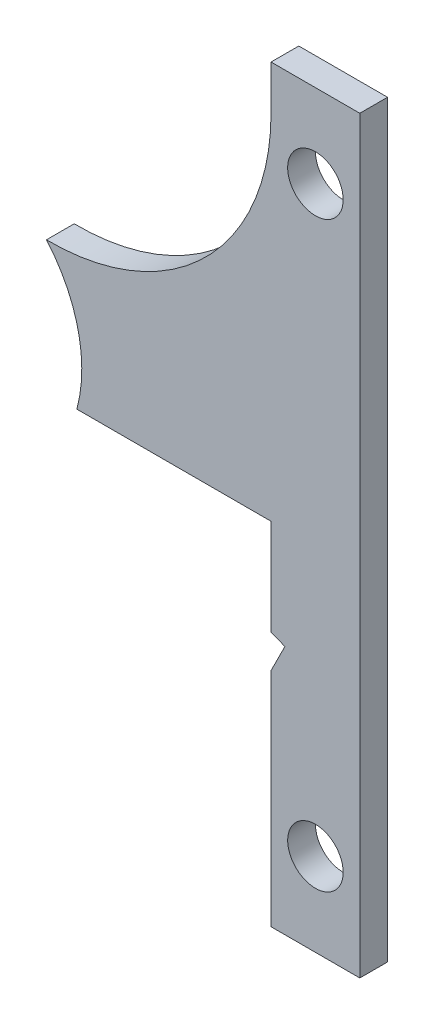
ISO-10303-21;
HEADER;
FILE_DESCRIPTION(('STEP AP214'),'2;1');
FILE_NAME('part.step','',(''),(''),'','','');
FILE_SCHEMA(('AUTOMOTIVE_DESIGN { 1 0 10303 214 1 1 1 1 }'));
ENDSEC;
DATA;
#1=APPLICATION_CONTEXT('core data for automotive mechanical design processes');
#2=APPLICATION_PROTOCOL_DEFINITION('international standard','automotive_design',2000,#1);
#3=PRODUCT_CONTEXT('',#1,'mechanical');
#4=PRODUCT('Part','Part','',(#3));
#5=PRODUCT_RELATED_PRODUCT_CATEGORY('part','',(#4));
#6=PRODUCT_DEFINITION_FORMATION('','',#4);
#7=PRODUCT_DEFINITION_CONTEXT('part definition',#1,'design');
#8=PRODUCT_DEFINITION('design','',#6,#7);
#9=PRODUCT_DEFINITION_SHAPE('','',#8);
#10=(LENGTH_UNIT() NAMED_UNIT(*) SI_UNIT(.MILLI.,.METRE.));
#11=(NAMED_UNIT(*) PLANE_ANGLE_UNIT() SI_UNIT($,.RADIAN.));
#12=(NAMED_UNIT(*) SI_UNIT($,.STERADIAN.) SOLID_ANGLE_UNIT());
#13=UNCERTAINTY_MEASURE_WITH_UNIT(LENGTH_MEASURE(1.E-05),#10,'distance_accuracy_value','');
#14=(GEOMETRIC_REPRESENTATION_CONTEXT(3) GLOBAL_UNCERTAINTY_ASSIGNED_CONTEXT((#13)) GLOBAL_UNIT_ASSIGNED_CONTEXT((#10,
#11,#12)) REPRESENTATION_CONTEXT('',''));
#15=CARTESIAN_POINT('',(0.,0.,0.));
#16=DIRECTION('',(0.,0.,1.));
#17=DIRECTION('',(1.,0.,0.));
#18=AXIS2_PLACEMENT_3D('',#15,#16,#17);
#19=CARTESIAN_POINT('',(60.,-24.0119449794001,2.5));
#20=DIRECTION('',(1.,0.,0.));
#21=DIRECTION('',(0.,0.,-1.));
#22=AXIS2_PLACEMENT_3D('',#19,#20,#21);
#23=PLANE('',#22);
#24=DIRECTION('',(0.,-1.,0.));
#25=VECTOR('',#24,1.);
#26=CARTESIAN_POINT('',(60.,-24.0119449794001,-2.5));
#27=LINE('',#26,#25);
#28=CARTESIAN_POINT('',(60.,-6.69872981077817,-2.5));
#29=VERTEX_POINT('',#28);
#30=CARTESIAN_POINT('',(60.,-24.0119449794001,-2.5));
#31=VERTEX_POINT('',#30);
#32=EDGE_CURVE('E147',#29,#31,#27,.T.);
#33=ORIENTED_EDGE('',*,*,#32,.T.);
#34=DIRECTION('',(0.,0.,-1.));
#35=VECTOR('',#34,1.);
#36=CARTESIAN_POINT('',(60.,-24.0119449794001,2.5));
#37=LINE('',#36,#35);
#38=CARTESIAN_POINT('',(60.,-24.0119449794001,2.5));
#39=VERTEX_POINT('',#38);
#40=EDGE_CURVE('E11',#39,#31,#37,.T.);
#41=ORIENTED_EDGE('',*,*,#40,.F.);
#42=DIRECTION('',(0.,-1.,0.));
#43=VECTOR('',#42,1.);
#44=CARTESIAN_POINT('',(60.,-24.0119449794001,2.5));
#45=LINE('',#44,#43);
#46=CARTESIAN_POINT('',(60.,-6.69872981077817,2.5));
#47=VERTEX_POINT('',#46);
#48=EDGE_CURVE('E170',#47,#39,#45,.T.);
#49=ORIENTED_EDGE('',*,*,#48,.F.);
#50=DIRECTION('',(0.,0.,-1.));
#51=VECTOR('',#50,1.);
#52=CARTESIAN_POINT('',(60.,-6.69872981077817,2.5));
#53=LINE('',#52,#51);
#54=EDGE_CURVE('E143',#47,#29,#53,.T.);
#55=ORIENTED_EDGE('',*,*,#54,.T.);
#56=EDGE_LOOP('',(#33,#41,#49,#55));
#57=FACE_BOUND('',#56,.T.);
#58=ADVANCED_FACE('F33',(#57),#23,.F.);
#59=CARTESIAN_POINT('',(62.49999830884,-25.,2.5));
#60=DIRECTION('',(0.367557094941416,0.930000958041564,0.));
#61=DIRECTION('',(-0.930000958041564,0.367557094941416,0.));
#62=AXIS2_PLACEMENT_3D('',#59,#60,#61);
#63=PLANE('',#62);
#64=DIRECTION('',(0.930000958041564,-0.367557094941416,0.));
#65=VECTOR('',#64,1.);
#66=CARTESIAN_POINT('',(62.49999830884,-25.,-2.5));
#67=LINE('',#66,#65);
#68=CARTESIAN_POINT('',(62.49999830884,-25.,-2.5));
#69=VERTEX_POINT('',#68);
#70=EDGE_CURVE('E150',#31,#69,#67,.T.);
#71=ORIENTED_EDGE('',*,*,#70,.T.);
#72=DIRECTION('',(0.,0.,-1.));
#73=VECTOR('',#72,1.);
#74=CARTESIAN_POINT('',(62.49999830884,-25.,2.5));
#75=LINE('',#74,#73);
#76=CARTESIAN_POINT('',(62.49999830884,-25.,2.5));
#77=VERTEX_POINT('',#76);
#78=EDGE_CURVE('E41',#77,#69,#75,.T.);
#79=ORIENTED_EDGE('',*,*,#78,.F.);
#80=DIRECTION('',(0.930000958041564,-0.367557094941416,0.));
#81=VECTOR('',#80,1.);
#82=CARTESIAN_POINT('',(62.49999830884,-25.,2.5));
#83=LINE('',#82,#81);
#84=EDGE_CURVE('E101',#39,#77,#83,.T.);
#85=ORIENTED_EDGE('',*,*,#84,.F.);
#86=ORIENTED_EDGE('',*,*,#40,.T.);
#87=EDGE_LOOP('',(#71,#79,#85,#86));
#88=FACE_BOUND('',#87,.T.);
#89=ADVANCED_FACE('F241',(#88),#63,.F.);
#90=CARTESIAN_POINT('',(60.,-30.,2.5));
#91=DIRECTION('',(0.894427312009458,-0.447213353480792,0.));
#92=DIRECTION('',(0.447213353480792,0.894427312009458,0.));
#93=AXIS2_PLACEMENT_3D('',#90,#91,#92);
#94=PLANE('',#93);
#95=DIRECTION('',(-0.447213353480792,-0.894427312009458,0.));
#96=VECTOR('',#95,1.);
#97=CARTESIAN_POINT('',(60.,-30.,-2.5));
#98=LINE('',#97,#96);
#99=CARTESIAN_POINT('',(60.,-30.,-2.5));
#100=VERTEX_POINT('',#99);
#101=EDGE_CURVE('E153',#69,#100,#98,.T.);
#102=ORIENTED_EDGE('',*,*,#101,.T.);
#103=DIRECTION('',(0.,0.,-1.));
#104=VECTOR('',#103,1.);
#105=CARTESIAN_POINT('',(60.,-30.,2.5));
#106=LINE('',#105,#104);
#107=CARTESIAN_POINT('',(60.,-30.,2.5));
#108=VERTEX_POINT('',#107);
#109=EDGE_CURVE('E186',#108,#100,#106,.T.);
#110=ORIENTED_EDGE('',*,*,#109,.F.);
#111=DIRECTION('',(-0.447213353480792,-0.894427312009458,0.));
#112=VECTOR('',#111,1.);
#113=CARTESIAN_POINT('',(60.,-30.,2.5));
#114=LINE('',#113,#112);
#115=EDGE_CURVE('E194',#77,#108,#114,.T.);
#116=ORIENTED_EDGE('',*,*,#115,.F.);
#117=ORIENTED_EDGE('',*,*,#78,.T.);
#118=EDGE_LOOP('',(#102,#110,#116,#117));
#119=FACE_BOUND('',#118,.T.);
#120=ADVANCED_FACE('F192',(#119),#94,.F.);
#121=CARTESIAN_POINT('',(60.,-70.,2.5));
#122=DIRECTION('',(1.,0.,0.));
#123=DIRECTION('',(0.,0.,-1.));
#124=AXIS2_PLACEMENT_3D('',#121,#122,#123);
#125=PLANE('',#124);
#126=DIRECTION('',(0.,-1.,0.));
#127=VECTOR('',#126,1.);
#128=CARTESIAN_POINT('',(60.,-70.,-2.5));
#129=LINE('',#128,#127);
#130=CARTESIAN_POINT('',(60.,-70.,-2.5));
#131=VERTEX_POINT('',#130);
#132=EDGE_CURVE('E155',#100,#131,#129,.T.);
#133=ORIENTED_EDGE('',*,*,#132,.T.);
#134=DIRECTION('',(0.,0.,-1.));
#135=VECTOR('',#134,1.);
#136=CARTESIAN_POINT('',(60.,-70.,2.5));
#137=LINE('',#136,#135);
#138=CARTESIAN_POINT('',(60.,-70.,2.5));
#139=VERTEX_POINT('',#138);
#140=EDGE_CURVE('E183',#139,#131,#137,.T.);
#141=ORIENTED_EDGE('',*,*,#140,.F.);
#142=DIRECTION('',(0.,-1.,0.));
#143=VECTOR('',#142,1.);
#144=CARTESIAN_POINT('',(60.,-70.,2.5));
#145=LINE('',#144,#143);
#146=EDGE_CURVE('E211',#108,#139,#145,.T.);
#147=ORIENTED_EDGE('',*,*,#146,.F.);
#148=ORIENTED_EDGE('',*,*,#109,.T.);
#149=EDGE_LOOP('',(#133,#141,#147,#148));
#150=FACE_BOUND('',#149,.T.);
#151=ADVANCED_FACE('F202',(#150),#125,.F.);
#152=CARTESIAN_POINT('',(75.999998510006,-70.,2.5));
#153=DIRECTION('',(0.,1.,0.));
#154=DIRECTION('',(0.,0.,1.));
#155=AXIS2_PLACEMENT_3D('',#152,#153,#154);
#156=PLANE('',#155);
#157=DIRECTION('',(1.,0.,0.));
#158=VECTOR('',#157,1.);
#159=CARTESIAN_POINT('',(75.999998510006,-70.,-2.5));
#160=LINE('',#159,#158);
#161=CARTESIAN_POINT('',(75.999998510006,-70.,-2.5));
#162=VERTEX_POINT('',#161);
#163=EDGE_CURVE('E157',#131,#162,#160,.T.);
#164=ORIENTED_EDGE('',*,*,#163,.T.);
#165=DIRECTION('',(0.,0.,-1.));
#166=VECTOR('',#165,1.);
#167=CARTESIAN_POINT('',(75.999998510006,-70.,2.5));
#168=LINE('',#167,#166);
#169=CARTESIAN_POINT('',(75.999998510006,-70.,2.5));
#170=VERTEX_POINT('',#169);
#171=EDGE_CURVE('E180',#170,#162,#168,.T.);
#172=ORIENTED_EDGE('',*,*,#171,.F.);
#173=DIRECTION('',(1.,0.,0.));
#174=VECTOR('',#173,1.);
#175=CARTESIAN_POINT('',(75.999998510006,-70.,2.5));
#176=LINE('',#175,#174);
#177=EDGE_CURVE('E208',#139,#170,#176,.T.);
#178=ORIENTED_EDGE('',*,*,#177,.F.);
#179=ORIENTED_EDGE('',*,*,#140,.T.);
#180=EDGE_LOOP('',(#164,#172,#178,#179));
#181=FACE_BOUND('',#180,.T.);
#182=ADVANCED_FACE('F206',(#181),#156,.F.);
#183=CARTESIAN_POINT('',(75.999998510006,65.,2.5));
#184=DIRECTION('',(-1.,0.,0.));
#185=DIRECTION('',(0.,0.,1.));
#186=AXIS2_PLACEMENT_3D('',#183,#184,#185);
#187=PLANE('',#186);
#188=DIRECTION('',(0.,1.,0.));
#189=VECTOR('',#188,1.);
#190=CARTESIAN_POINT('',(75.999998510006,65.,-2.5));
#191=LINE('',#190,#189);
#192=CARTESIAN_POINT('',(75.999998510006,65.,-2.5));
#193=VERTEX_POINT('',#192);
#194=EDGE_CURVE('E160',#162,#193,#191,.T.);
#195=ORIENTED_EDGE('',*,*,#194,.T.);
#196=DIRECTION('',(0.,0.,-1.));
#197=VECTOR('',#196,1.);
#198=CARTESIAN_POINT('',(75.999998510006,65.,2.5));
#199=LINE('',#198,#197);
#200=CARTESIAN_POINT('',(75.999998510006,65.,2.5));
#201=VERTEX_POINT('',#200);
#202=EDGE_CURVE('E177',#201,#193,#199,.T.);
#203=ORIENTED_EDGE('',*,*,#202,.F.);
#204=DIRECTION('',(0.,1.,0.));
#205=VECTOR('',#204,1.);
#206=CARTESIAN_POINT('',(75.999998510006,62.,2.5));
#207=LINE('',#206,#205);
#208=EDGE_CURVE('E210',#170,#201,#207,.T.);
#209=ORIENTED_EDGE('',*,*,#208,.F.);
#210=ORIENTED_EDGE('',*,*,#171,.T.);
#211=EDGE_LOOP('',(#195,#203,#209,#210));
#212=FACE_BOUND('',#211,.T.);
#213=ADVANCED_FACE('F254',(#212),#187,.F.);
#214=CARTESIAN_POINT('',(59.999998510006,65.,2.5));
#215=DIRECTION('',(0.,-1.,0.));
#216=DIRECTION('',(0.,0.,-1.));
#217=AXIS2_PLACEMENT_3D('',#214,#215,#216);
#218=PLANE('',#217);
#219=DIRECTION('',(-1.,0.,0.));
#220=VECTOR('',#219,1.);
#221=CARTESIAN_POINT('',(59.999998510006,65.,-2.5));
#222=LINE('',#221,#220);
#223=CARTESIAN_POINT('',(59.999998510006,65.,-2.5));
#224=VERTEX_POINT('',#223);
#225=EDGE_CURVE('E162',#193,#224,#222,.T.);
#226=ORIENTED_EDGE('',*,*,#225,.T.);
#227=DIRECTION('',(0.,0.,-1.));
#228=VECTOR('',#227,1.);
#229=CARTESIAN_POINT('',(59.999998510006,65.,2.5));
#230=LINE('',#229,#228);
#231=CARTESIAN_POINT('',(59.999998510006,65.,2.5));
#232=VERTEX_POINT('',#231);
#233=EDGE_CURVE('E174',#232,#224,#230,.T.);
#234=ORIENTED_EDGE('',*,*,#233,.F.);
#235=DIRECTION('',(-1.,0.,0.));
#236=VECTOR('',#235,1.);
#237=CARTESIAN_POINT('',(59.999998510006,65.,2.5));
#238=LINE('',#237,#236);
#239=EDGE_CURVE('E213',#201,#232,#238,.T.);
#240=ORIENTED_EDGE('',*,*,#239,.F.);
#241=ORIENTED_EDGE('',*,*,#202,.T.);
#242=EDGE_LOOP('',(#226,#234,#240,#241));
#243=FACE_BOUND('',#242,.T.);
#244=ADVANCED_FACE('F222',(#243),#218,.F.);
#245=CARTESIAN_POINT('',(59.999998510006,57.0000000000019,2.5));
#246=DIRECTION('',(1.,0.,0.));
#247=DIRECTION('',(0.,0.,-1.));
#248=AXIS2_PLACEMENT_3D('',#245,#246,#247);
#249=PLANE('',#248);
#250=DIRECTION('',(0.,-1.,0.));
#251=VECTOR('',#250,1.);
#252=CARTESIAN_POINT('',(59.999998510006,57.0000000000019,-2.5));
#253=LINE('',#252,#251);
#254=CARTESIAN_POINT('',(59.999998510006,57.0000000000019,-2.5));
#255=VERTEX_POINT('',#254);
#256=EDGE_CURVE('E165',#224,#255,#253,.T.);
#257=ORIENTED_EDGE('',*,*,#256,.T.);
#258=DIRECTION('',(0.,0.,-1.));
#259=VECTOR('',#258,1.);
#260=CARTESIAN_POINT('',(59.999998510006,57.0000000000019,2.5));
#261=LINE('',#260,#259);
#262=CARTESIAN_POINT('',(59.999998510006,57.0000000000019,2.5));
#263=VERTEX_POINT('',#262);
#264=EDGE_CURVE('E138',#263,#255,#261,.T.);
#265=ORIENTED_EDGE('',*,*,#264,.F.);
#266=DIRECTION('',(0.,-1.,0.));
#267=VECTOR('',#266,1.);
#268=CARTESIAN_POINT('',(59.999998510006,62.,2.5));
#269=LINE('',#268,#267);
#270=EDGE_CURVE('E129',#232,#263,#269,.T.);
#271=ORIENTED_EDGE('',*,*,#270,.F.);
#272=ORIENTED_EDGE('',*,*,#233,.T.);
#273=EDGE_LOOP('',(#257,#265,#271,#272));
#274=FACE_BOUND('',#273,.T.);
#275=ADVANCED_FACE('F225',(#274),#249,.F.);
#276=CARTESIAN_POINT('',(19.999998510006,57.0000000000019,2.5));
#277=DIRECTION('',(0.,0.,-1.));
#278=DIRECTION('',(-1.,0.,0.));
#279=AXIS2_PLACEMENT_3D('',#276,#277,#278);
#280=CYLINDRICAL_SURFACE('',#279,40.);
#281=CARTESIAN_POINT('',(19.999998510006,57.0000000000019,-2.5));
#282=DIRECTION('',(0.,0.,-1.));
#283=DIRECTION('',(-1.,0.,0.));
#284=AXIS2_PLACEMENT_3D('',#281,#282,#283);
#285=CIRCLE('',#284,40.);
#286=CARTESIAN_POINT('',(19.5133885618303,17.0029599750408,-2.5));
#287=VERTEX_POINT('',#286);
#288=EDGE_CURVE('E137',#255,#287,#285,.T.);
#289=ORIENTED_EDGE('',*,*,#288,.T.);
#290=DIRECTION('',(0.,0.,-1.));
#291=VECTOR('',#290,1.);
#292=CARTESIAN_POINT('',(19.5133885618303,17.0029599750408,2.5));
#293=LINE('',#292,#291);
#294=CARTESIAN_POINT('',(19.5133885618303,17.0029599750408,2.5));
#295=VERTEX_POINT('',#294);
#296=EDGE_CURVE('E134',#295,#287,#293,.T.);
#297=ORIENTED_EDGE('',*,*,#296,.F.);
#298=CARTESIAN_POINT('',(19.999998510006,57.0000000000019,2.5));
#299=DIRECTION('',(0.,0.,-1.));
#300=DIRECTION('',(-1.,0.,0.));
#301=AXIS2_PLACEMENT_3D('',#298,#299,#300);
#302=CIRCLE('',#301,40.);
#303=EDGE_CURVE('E123',#263,#295,#302,.T.);
#304=ORIENTED_EDGE('',*,*,#303,.F.);
#305=ORIENTED_EDGE('',*,*,#264,.T.);
#306=EDGE_LOOP('',(#289,#297,#304,#305));
#307=FACE_BOUND('',#306,.T.);
#308=ADVANCED_FACE('F135',(#307),#280,.F.);
#309=CARTESIAN_POINT('',(0.,0.,2.5));
#310=DIRECTION('',(0.,0.,-1.));
#311=DIRECTION('',(-1.,0.,0.));
#312=AXIS2_PLACEMENT_3D('',#309,#310,#311);
#313=CYLINDRICAL_SURFACE('',#312,25.8819045102521);
#314=CARTESIAN_POINT('',(0.,0.,-2.5));
#315=DIRECTION('',(0.,0.,-1.));
#316=DIRECTION('',(1.,0.,0.));
#317=AXIS2_PLACEMENT_3D('',#314,#315,#316);
#318=CIRCLE('',#317,25.8819045102521);
#319=CARTESIAN_POINT('',(25.,-6.69872981077817,-2.5));
#320=VERTEX_POINT('',#319);
#321=EDGE_CURVE('E87',#287,#320,#318,.T.);
#322=ORIENTED_EDGE('',*,*,#321,.T.);
#323=DIRECTION('',(0.,0.,-1.));
#324=VECTOR('',#323,1.);
#325=CARTESIAN_POINT('',(25.,-6.69872981077817,2.5));
#326=LINE('',#325,#324);
#327=CARTESIAN_POINT('',(25.,-6.69872981077817,2.5));
#328=VERTEX_POINT('',#327);
#329=EDGE_CURVE('E139',#328,#320,#326,.T.);
#330=ORIENTED_EDGE('',*,*,#329,.F.);
#331=CARTESIAN_POINT('',(0.,0.,2.5));
#332=DIRECTION('',(0.,0.,-1.));
#333=DIRECTION('',(1.,0.,0.));
#334=AXIS2_PLACEMENT_3D('',#331,#332,#333);
#335=CIRCLE('',#334,25.8819045102521);
#336=EDGE_CURVE('E127',#295,#328,#335,.T.);
#337=ORIENTED_EDGE('',*,*,#336,.F.);
#338=ORIENTED_EDGE('',*,*,#296,.T.);
#339=EDGE_LOOP('',(#322,#330,#337,#338));
#340=FACE_BOUND('',#339,.T.);
#341=ADVANCED_FACE('F141',(#340),#313,.F.);
#342=CARTESIAN_POINT('',(25.,-6.69872981077817,2.5));
#343=DIRECTION('',(0.,1.,0.));
#344=DIRECTION('',(0.,0.,1.));
#345=AXIS2_PLACEMENT_3D('',#342,#343,#344);
#346=PLANE('',#345);
#347=DIRECTION('',(1.,0.,0.));
#348=VECTOR('',#347,1.);
#349=CARTESIAN_POINT('',(25.,-6.69872981077817,-2.5));
#350=LINE('',#349,#348);
#351=EDGE_CURVE('E93',#320,#29,#350,.T.);
#352=ORIENTED_EDGE('',*,*,#351,.T.);
#353=ORIENTED_EDGE('',*,*,#54,.F.);
#354=DIRECTION('',(1.,0.,0.));
#355=VECTOR('',#354,1.);
#356=CARTESIAN_POINT('',(25.,-6.69872981077817,2.5));
#357=LINE('',#356,#355);
#358=EDGE_CURVE('E49',#328,#47,#357,.T.);
#359=ORIENTED_EDGE('',*,*,#358,.F.);
#360=ORIENTED_EDGE('',*,*,#329,.T.);
#361=EDGE_LOOP('',(#352,#353,#359,#360));
#362=FACE_BOUND('',#361,.T.);
#363=ADVANCED_FACE('F229',(#362),#346,.F.);
#364=CARTESIAN_POINT('',(0.,0.,2.5));
#365=DIRECTION('',(0.,0.,1.));
#366=DIRECTION('',(1.,0.,0.));
#367=AXIS2_PLACEMENT_3D('',#364,#365,#366);
#368=PLANE('',#367);
#369=CARTESIAN_POINT('',(67.999998510006,50.,2.5));
#370=DIRECTION('',(0.,0.,1.));
#371=DIRECTION('',(1.,0.,0.));
#372=AXIS2_PLACEMENT_3D('',#369,#370,#371);
#373=CIRCLE('',#372,4.99999999999999);
#374=CARTESIAN_POINT('',(72.999998510006,50.,2.5));
#375=VERTEX_POINT('',#374);
#376=EDGE_CURVE('E319',#375,#375,#373,.T.);
#377=ORIENTED_EDGE('',*,*,#376,.F.);
#378=EDGE_LOOP('',(#377));
#379=FACE_BOUND('',#378,.T.);
#380=CARTESIAN_POINT('',(67.999998510006,-55.,2.5));
#381=DIRECTION('',(0.,0.,1.));
#382=DIRECTION('',(1.,0.,0.));
#383=AXIS2_PLACEMENT_3D('',#380,#381,#382);
#384=CIRCLE('',#383,4.99999999999999);
#385=CARTESIAN_POINT('',(72.999998510006,-55.,2.5));
#386=VERTEX_POINT('',#385);
#387=EDGE_CURVE('E321',#386,#386,#384,.T.);
#388=ORIENTED_EDGE('',*,*,#387,.F.);
#389=EDGE_LOOP('',(#388));
#390=FACE_BOUND('',#389,.T.);
#391=ORIENTED_EDGE('',*,*,#48,.T.);
#392=ORIENTED_EDGE('',*,*,#84,.T.);
#393=ORIENTED_EDGE('',*,*,#115,.T.);
#394=ORIENTED_EDGE('',*,*,#146,.T.);
#395=ORIENTED_EDGE('',*,*,#177,.T.);
#396=ORIENTED_EDGE('',*,*,#208,.T.);
#397=ORIENTED_EDGE('',*,*,#239,.T.);
#398=ORIENTED_EDGE('',*,*,#270,.T.);
#399=ORIENTED_EDGE('',*,*,#303,.T.);
#400=ORIENTED_EDGE('',*,*,#336,.T.);
#401=ORIENTED_EDGE('',*,*,#358,.T.);
#402=EDGE_LOOP('',(#391,#392,#393,#394,#395,#396,#397,#398,#399,#400,#401));
#403=FACE_BOUND('',#402,.T.);
#404=ADVANCED_FACE('F125',(#379,#390,#403),#368,.T.);
#405=CARTESIAN_POINT('',(0.,0.,-2.5));
#406=DIRECTION('',(0.,0.,1.));
#407=DIRECTION('',(1.,0.,0.));
#408=AXIS2_PLACEMENT_3D('',#405,#406,#407);
#409=PLANE('',#408);
#410=CARTESIAN_POINT('',(67.999998510006,50.,-2.5));
#411=DIRECTION('',(0.,0.,1.));
#412=DIRECTION('',(1.,0.,0.));
#413=AXIS2_PLACEMENT_3D('',#410,#411,#412);
#414=CIRCLE('',#413,5.);
#415=CARTESIAN_POINT('',(72.999998510006,50.,-2.5));
#416=VERTEX_POINT('',#415);
#417=EDGE_CURVE('E316',#416,#416,#414,.T.);
#418=ORIENTED_EDGE('',*,*,#417,.T.);
#419=EDGE_LOOP('',(#418));
#420=FACE_BOUND('',#419,.T.);
#421=CARTESIAN_POINT('',(67.999998510006,-55.,-2.5));
#422=DIRECTION('',(0.,0.,1.));
#423=DIRECTION('',(1.,0.,0.));
#424=AXIS2_PLACEMENT_3D('',#421,#422,#423);
#425=CIRCLE('',#424,5.);
#426=CARTESIAN_POINT('',(72.999998510006,-55.,-2.5));
#427=VERTEX_POINT('',#426);
#428=EDGE_CURVE('E151',#427,#427,#425,.T.);
#429=ORIENTED_EDGE('',*,*,#428,.T.);
#430=EDGE_LOOP('',(#429));
#431=FACE_BOUND('',#430,.T.);
#432=ORIENTED_EDGE('',*,*,#32,.F.);
#433=ORIENTED_EDGE('',*,*,#351,.F.);
#434=ORIENTED_EDGE('',*,*,#321,.F.);
#435=ORIENTED_EDGE('',*,*,#288,.F.);
#436=ORIENTED_EDGE('',*,*,#256,.F.);
#437=ORIENTED_EDGE('',*,*,#225,.F.);
#438=ORIENTED_EDGE('',*,*,#194,.F.);
#439=ORIENTED_EDGE('',*,*,#163,.F.);
#440=ORIENTED_EDGE('',*,*,#132,.F.);
#441=ORIENTED_EDGE('',*,*,#101,.F.);
#442=ORIENTED_EDGE('',*,*,#70,.F.);
#443=EDGE_LOOP('',(#432,#433,#434,#435,#436,#437,#438,#439,#440,#441,#442));
#444=FACE_BOUND('',#443,.T.);
#445=ADVANCED_FACE('F198',(#420,#431,#444),#409,.F.);
#446=CARTESIAN_POINT('',(67.999998510006,-55.,2.5));
#447=DIRECTION('',(0.,0.,1.));
#448=DIRECTION('',(1.,0.,0.));
#449=AXIS2_PLACEMENT_3D('',#446,#447,#448);
#450=CYLINDRICAL_SURFACE('',#449,5.);
#451=ORIENTED_EDGE('',*,*,#428,.F.);
#452=EDGE_LOOP('',(#451));
#453=FACE_BOUND('',#452,.T.);
#454=ORIENTED_EDGE('',*,*,#387,.T.);
#455=EDGE_LOOP('',(#454));
#456=FACE_BOUND('',#455,.T.);
#457=ADVANCED_FACE('F290',(#453,#456),#450,.F.);
#458=CARTESIAN_POINT('',(67.999998510006,50.,2.5));
#459=DIRECTION('',(0.,0.,1.));
#460=DIRECTION('',(1.,0.,0.));
#461=AXIS2_PLACEMENT_3D('',#458,#459,#460);
#462=CYLINDRICAL_SURFACE('',#461,5.);
#463=ORIENTED_EDGE('',*,*,#417,.F.);
#464=EDGE_LOOP('',(#463));
#465=FACE_BOUND('',#464,.T.);
#466=ORIENTED_EDGE('',*,*,#376,.T.);
#467=EDGE_LOOP('',(#466));
#468=FACE_BOUND('',#467,.T.);
#469=ADVANCED_FACE('F299',(#465,#468),#462,.F.);
#470=CLOSED_SHELL('',(#58,#89,#120,#151,#182,#213,#244,#275,#308,#341,#363,#404,#445,#457,#469));
#471=MANIFOLD_SOLID_BREP('B2',#470);
#472=ADVANCED_BREP_SHAPE_REPRESENTATION('',(#18,#471),#14);
#473=SHAPE_DEFINITION_REPRESENTATION(#9,#472);
ENDSEC;
END-ISO-10303-21;
